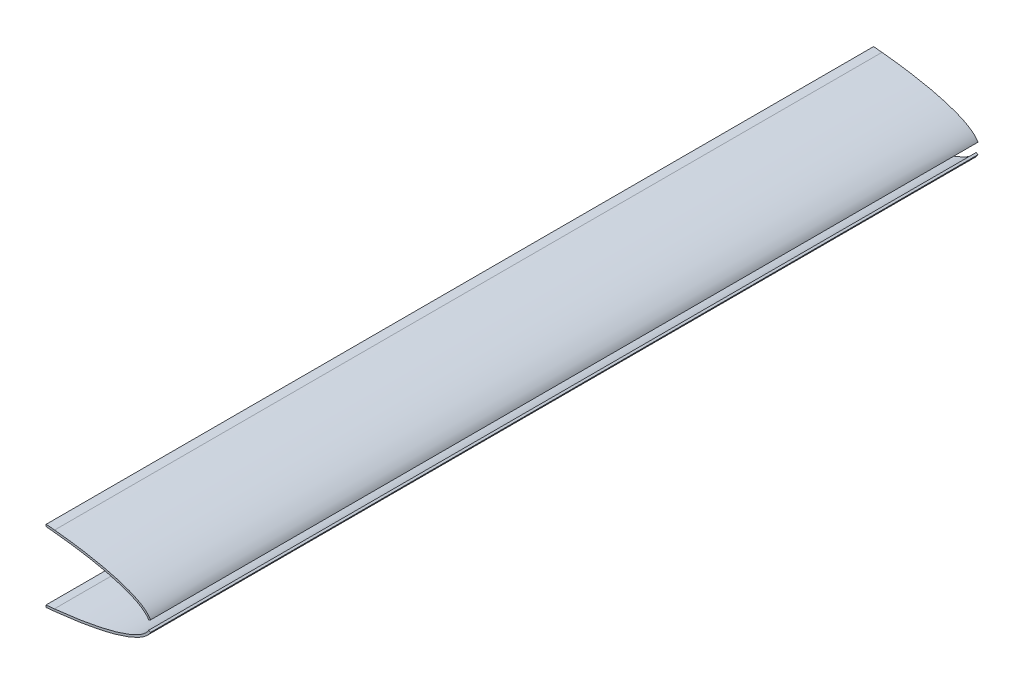
ISO-10303-21;
HEADER;
FILE_DESCRIPTION(('STEP AP214'),'2;1');
FILE_NAME('part.step','',(''),(''),'','','');
FILE_SCHEMA(('AUTOMOTIVE_DESIGN { 1 0 10303 214 1 1 1 1 }'));
ENDSEC;
DATA;
#1=APPLICATION_CONTEXT('core data for automotive mechanical design processes');
#2=APPLICATION_PROTOCOL_DEFINITION('international standard','automotive_design',2000,#1);
#3=PRODUCT_CONTEXT('',#1,'mechanical');
#4=PRODUCT('Part','Part','',(#3));
#5=PRODUCT_RELATED_PRODUCT_CATEGORY('part','',(#4));
#6=PRODUCT_DEFINITION_FORMATION('','',#4);
#7=PRODUCT_DEFINITION_CONTEXT('part definition',#1,'design');
#8=PRODUCT_DEFINITION('design','',#6,#7);
#9=PRODUCT_DEFINITION_SHAPE('','',#8);
#10=(LENGTH_UNIT() NAMED_UNIT(*) SI_UNIT(.MILLI.,.METRE.));
#11=(NAMED_UNIT(*) PLANE_ANGLE_UNIT() SI_UNIT($,.RADIAN.));
#12=(NAMED_UNIT(*) SI_UNIT($,.STERADIAN.) SOLID_ANGLE_UNIT());
#13=UNCERTAINTY_MEASURE_WITH_UNIT(LENGTH_MEASURE(1.E-05),#10,'distance_accuracy_value','');
#14=(GEOMETRIC_REPRESENTATION_CONTEXT(3) GLOBAL_UNCERTAINTY_ASSIGNED_CONTEXT((#13)) GLOBAL_UNIT_ASSIGNED_CONTEXT((#10,
#11,#12)) REPRESENTATION_CONTEXT('',''));
#15=CARTESIAN_POINT('',(0.,0.,0.));
#16=DIRECTION('',(0.,0.,1.));
#17=DIRECTION('',(1.,0.,0.));
#18=AXIS2_PLACEMENT_3D('',#15,#16,#17);
#19=CARTESIAN_POINT('',(-17.8267838835483,9.47682119762412,0.));
#20=DIRECTION('',(0.,0.,-1.));
#21=DIRECTION('',(-1.,0.,0.));
#22=AXIS2_PLACEMENT_3D('',#19,#20,#21);
#23=PLANE('',#22);
#24=DIRECTION('',(-0.995201674522241,0.0978449131438533,0.));
#25=VECTOR('',#24,1.);
#26=CARTESIAN_POINT('',(-39.9223356001921,13.5973067101086,0.));
#27=LINE('',#26,#25);
#28=CARTESIAN_POINT('',(-36.7625702835839,13.2866491108769,0.));
#29=VERTEX_POINT('',#28);
#30=CARTESIAN_POINT('',(-39.9223356001921,13.5973067101086,0.));
#31=VERTEX_POINT('',#30);
#32=EDGE_CURVE('E102',#29,#31,#27,.T.);
#33=ORIENTED_EDGE('',*,*,#32,.T.);
#34=DIRECTION('',(0.0978449131438549,0.99520167452224,0.));
#35=VECTOR('',#34,1.);
#36=CARTESIAN_POINT('',(-40.,12.8073653809566,0.));
#37=LINE('',#36,#35);
#38=CARTESIAN_POINT('',(-40.,12.8073653809566,0.));
#39=VERTEX_POINT('',#38);
#40=EDGE_CURVE('E112',#39,#31,#37,.T.);
#41=ORIENTED_EDGE('',*,*,#40,.F.);
#42=DIRECTION('',(-0.995201674522241,0.0978449131438533,0.));
#43=VECTOR('',#42,1.);
#44=CARTESIAN_POINT('',(-40.,12.8073653809566,0.));
#45=LINE('',#44,#43);
#46=CARTESIAN_POINT('',(-36.8402346833918,12.4967077817249,0.));
#47=VERTEX_POINT('',#46);
#48=EDGE_CURVE('E117',#47,#39,#45,.T.);
#49=ORIENTED_EDGE('',*,*,#48,.F.);
#50=CARTESIAN_POINT('',(-1.24390658489826,1.66378358121929,0.));
#51=CARTESIAN_POINT('',(-1.48860479567891,2.11173841568091,0.));
#52=CARTESIAN_POINT('',(-2.18721549392838,2.9915410497157,0.));
#53=CARTESIAN_POINT('',(-3.56684606177441,4.12640868291193,0.));
#54=CARTESIAN_POINT('',(-5.70242251125246,5.44787577324311,0.));
#55=CARTESIAN_POINT('',(-8.61610729828475,6.76639290695171,0.));
#56=CARTESIAN_POINT('',(-12.270596889148,8.02813836591854,0.));
#57=CARTESIAN_POINT('',(-16.0123966431418,9.06626054111463,0.));
#58=CARTESIAN_POINT('',(-21.070097899829,10.2293693862457,0.));
#59=CARTESIAN_POINT('',(-27.474178441719,11.3617862397886,0.));
#60=CARTESIAN_POINT('',(-33.1756249099201,12.1012569038898,0.));
#61=CARTESIAN_POINT('',(-36.3030087720962,12.4403332320218,0.));
#62=CARTESIAN_POINT('',(-36.8402346833918,12.4967077817249,0.));
#63=B_SPLINE_CURVE_WITH_KNOTS('',3,(#50,#51,#52,#53,#54,#55,#56,#57,#58,#59,#60,#61,#62),
.UNSPECIFIED.,.F.,.F.,(4,1,1,1,1,1,1,1,1,1,4),(0.419885952901703,0.423416199832594,
0.427262438250806,0.431108676669019,0.438801153505443,0.446493630341868,0.454186107178292,
0.461878584014717,0.477263537687566,0.492648491360415,0.49583777009465),.UNSPECIFIED.);
#64=CARTESIAN_POINT('',(-1.24390658489826,1.66378358121929,0.));
#65=VERTEX_POINT('',#64);
#66=EDGE_CURVE('E129',#65,#47,#63,.T.);
#67=ORIENTED_EDGE('',*,*,#66,.F.);
#68=DIRECTION('',(-0.877599566613759,-0.479394410354713,0.));
#69=VECTOR('',#68,1.);
#70=CARTESIAN_POINT('',(-0.547311928898585,2.04430289443835,0.));
#71=LINE('',#70,#69);
#72=CARTESIAN_POINT('',(-0.547311928898585,2.04430289443835,0.));
#73=VERTEX_POINT('',#72);
#74=EDGE_CURVE('E133',#73,#65,#71,.T.);
#75=ORIENTED_EDGE('',*,*,#74,.F.);
#76=CARTESIAN_POINT('',(-0.547311928898588,2.04430289443835,0.));
#77=CARTESIAN_POINT('',(-0.742452555230262,2.40153515669752,0.));
#78=CARTESIAN_POINT('',(-0.978871222160533,2.73276732503177,0.));
#79=CARTESIAN_POINT('',(-1.50095969632098,3.3510397947876,0.));
#80=CARTESIAN_POINT('',(-1.78583987074471,3.63774075179793,0.));
#81=CARTESIAN_POINT('',(-2.68772385093515,4.44645055634845,0.));
#82=CARTESIAN_POINT('',(-3.34981290597311,4.91587372171695,0.));
#83=CARTESIAN_POINT('',(-4.72430500394808,5.76618124411193,0.));
#84=CARTESIAN_POINT('',(-5.43643688770976,6.14668207644938,0.));
#85=CARTESIAN_POINT('',(-6.89167647601701,6.84788997752939,0.));
#86=CARTESIAN_POINT('',(-7.63491447562696,7.16725907680991,0.));
#87=CARTESIAN_POINT('',(-9.88457449765326,8.05960638794077,0.));
#88=CARTESIAN_POINT('',(-11.41796986349,8.56968927722106,0.));
#89=CARTESIAN_POINT('',(-14.5139146726733,9.48310358153928,0.));
#90=CARTESIAN_POINT('',(-16.0777655978353,9.8855129673522,0.));
#91=CARTESIAN_POINT('',(-20.7937299410926,10.9806945347714,0.));
#92=CARTESIAN_POINT('',(-23.9705894672898,11.5634191498812,0.));
#93=CARTESIAN_POINT('',(-28.7548316760731,12.3021854418957,0.));
#94=CARTESIAN_POINT('',(-30.3530635628128,12.5256161016781,0.));
#95=CARTESIAN_POINT('',(-32.7542036699774,12.8316251026852,0.));
#96=CARTESIAN_POINT('',(-33.5552061921999,12.9287689266811,0.));
#97=CARTESIAN_POINT('',(-34.757442830836,13.0678257471092,0.));
#98=CARTESIAN_POINT('',(-35.1583058222855,13.1130691944258,0.));
#99=CARTESIAN_POINT('',(-35.9602710933766,13.201436773247,0.));
#100=CARTESIAN_POINT('',(-36.3627073317402,13.2446891129014,0.));
#101=CARTESIAN_POINT('',(-36.7625702835839,13.2866491108769,0.));
#102=B_SPLINE_CURVE_WITH_KNOTS('',3,(#76,#77,#78,#79,#80,#81,#82,#83,#84,#85,#86,#87,#88,#89,
#90,#91,#92,#93,#94,#95,#96,#97,#98,#99,#100,#101),.UNSPECIFIED.,.F.,.F.,(4,2,2,2,2,2,2,2,2,2,2,
2,4),(0.,0.03125,0.0625000000000001,0.125,0.1875,0.25,0.375,0.5,0.75,0.875,0.9375,0.96875,1.),.UNSPECIFIED.);
#103=EDGE_CURVE('E108',#73,#29,#102,.T.);
#104=ORIENTED_EDGE('',*,*,#103,.T.);
#105=EDGE_LOOP('',(#33,#41,#49,#67,#75,#104));
#106=FACE_BOUND('',#105,.T.);
#107=ADVANCED_FACE('F47',(#106),#23,.F.);
#108=CARTESIAN_POINT('',(-40.,12.8073653809566,-353.318000561689));
#109=DIRECTION('',(0.995201674522241,-0.0978449131438549,0.));
#110=DIRECTION('',(0.0978449131438549,0.995201674522241,0.));
#111=AXIS2_PLACEMENT_3D('',#108,#109,#110);
#112=PLANE('',#111);
#113=DIRECTION('',(0.,0.,1.));
#114=VECTOR('',#113,1.);
#115=CARTESIAN_POINT('',(-39.9223356001921,13.5973067101086,-353.318000561689));
#116=LINE('',#115,#114);
#117=CARTESIAN_POINT('',(-39.9223356001921,13.5973067101086,-312.1));
#118=VERTEX_POINT('',#117);
#119=EDGE_CURVE('E99',#118,#31,#116,.T.);
#120=ORIENTED_EDGE('',*,*,#119,.F.);
#121=DIRECTION('',(-0.0978449131438549,-0.995201674522241,0.));
#122=VECTOR('',#121,1.);
#123=CARTESIAN_POINT('',(-40.,12.8073653809566,-312.1));
#124=LINE('',#123,#122);
#125=CARTESIAN_POINT('',(-40.,12.8073653809566,-312.1));
#126=VERTEX_POINT('',#125);
#127=EDGE_CURVE('E52',#118,#126,#124,.T.);
#128=ORIENTED_EDGE('',*,*,#127,.T.);
#129=DIRECTION('',(0.,0.,1.));
#130=VECTOR('',#129,1.);
#131=CARTESIAN_POINT('',(-40.,12.8073653809566,-353.318000561689));
#132=LINE('',#131,#130);
#133=EDGE_CURVE('E107',#126,#39,#132,.T.);
#134=ORIENTED_EDGE('',*,*,#133,.T.);
#135=ORIENTED_EDGE('',*,*,#40,.T.);
#136=EDGE_LOOP('',(#120,#128,#134,#135));
#137=FACE_BOUND('',#136,.T.);
#138=ADVANCED_FACE('F115',(#137),#112,.F.);
#139=CARTESIAN_POINT('',(-40.,12.8073653809566,-353.318000561689));
#140=DIRECTION('',(0.0978449131438533,0.995201674522241,0.));
#141=DIRECTION('',(-0.995201674522241,0.0978449131438533,0.));
#142=AXIS2_PLACEMENT_3D('',#139,#140,#141);
#143=PLANE('',#142);
#144=ORIENTED_EDGE('',*,*,#133,.F.);
#145=DIRECTION('',(0.995201674522241,-0.0978449131438533,0.));
#146=VECTOR('',#145,1.);
#147=CARTESIAN_POINT('',(-40.,12.8073653809566,-312.1));
#148=LINE('',#147,#146);
#149=CARTESIAN_POINT('',(-36.8402346833918,12.4967077817249,-312.1));
#150=VERTEX_POINT('',#149);
#151=EDGE_CURVE('E160',#126,#150,#148,.T.);
#152=ORIENTED_EDGE('',*,*,#151,.T.);
#153=DIRECTION('',(0.,0.,1.));
#154=VECTOR('',#153,1.);
#155=CARTESIAN_POINT('',(-36.8402346833918,12.4967077817249,-353.318000561689));
#156=LINE('',#155,#154);
#157=EDGE_CURVE('E155',#150,#47,#156,.T.);
#158=ORIENTED_EDGE('',*,*,#157,.T.);
#159=ORIENTED_EDGE('',*,*,#48,.T.);
#160=EDGE_LOOP('',(#144,#152,#158,#159));
#161=FACE_BOUND('',#160,.T.);
#162=ADVANCED_FACE('F156',(#161),#143,.F.);
#163=CARTESIAN_POINT('',(-1.24390658489826,1.66378358121929,-353.318000561689));
#164=CARTESIAN_POINT('',(-1.48860479567891,2.11173841568091,-353.318000561689));
#165=CARTESIAN_POINT('',(-2.18721549392838,2.9915410497157,-353.318000561689));
#166=CARTESIAN_POINT('',(-3.56684606177441,4.12640868291193,-353.318000561689));
#167=CARTESIAN_POINT('',(-5.70242251125246,5.44787577324311,-353.318000561689));
#168=CARTESIAN_POINT('',(-8.61610729828475,6.76639290695171,-353.318000561689));
#169=CARTESIAN_POINT('',(-12.270596889148,8.02813836591854,-353.318000561689));
#170=CARTESIAN_POINT('',(-16.0123966431418,9.06626054111463,-353.318000561689));
#171=CARTESIAN_POINT('',(-21.070097899829,10.2293693862457,-353.318000561689));
#172=CARTESIAN_POINT('',(-27.474178441719,11.3617862397886,-353.318000561689));
#173=CARTESIAN_POINT('',(-33.1756249099201,12.1012569038898,-353.318000561689));
#174=CARTESIAN_POINT('',(-36.3030087720962,12.4403332320218,-353.318000561689));
#175=CARTESIAN_POINT('',(-36.8402346833918,12.4967077817249,-353.318000561689));
#176=B_SPLINE_CURVE_WITH_KNOTS('',3,(#163,#164,#165,#166,#167,#168,#169,#170,#171,#172,#173,
#174,#175),.UNSPECIFIED.,.F.,.F.,(4,1,1,1,1,1,1,1,1,1,4),(0.419885952901703,0.423416199832594,
0.427262438250806,0.431108676669019,0.438801153505443,0.446493630341868,0.454186107178292,
0.461878584014717,0.477263537687566,0.492648491360415,0.49583777009465),.UNSPECIFIED.);
#177=DIRECTION('',(0.,0.,1.));
#178=VECTOR('',#177,1.);
#179=SURFACE_OF_LINEAR_EXTRUSION('',#176,#178);
#180=ORIENTED_EDGE('',*,*,#157,.F.);
#181=CARTESIAN_POINT('',(-1.24390658489826,1.66378358121929,-312.1));
#182=CARTESIAN_POINT('',(-1.48860479567891,2.11173841568091,-312.1));
#183=CARTESIAN_POINT('',(-2.18721549392838,2.9915410497157,-312.1));
#184=CARTESIAN_POINT('',(-3.56684606177441,4.12640868291193,-312.1));
#185=CARTESIAN_POINT('',(-5.70242251125246,5.44787577324311,-312.1));
#186=CARTESIAN_POINT('',(-8.61610729828475,6.76639290695171,-312.1));
#187=CARTESIAN_POINT('',(-12.270596889148,8.02813836591854,-312.1));
#188=CARTESIAN_POINT('',(-16.0123966431418,9.06626054111463,-312.1));
#189=CARTESIAN_POINT('',(-21.070097899829,10.2293693862457,-312.1));
#190=CARTESIAN_POINT('',(-27.474178441719,11.3617862397886,-312.1));
#191=CARTESIAN_POINT('',(-33.1756249099201,12.1012569038898,-312.1));
#192=CARTESIAN_POINT('',(-36.3030087720962,12.4403332320218,-312.1));
#193=CARTESIAN_POINT('',(-36.8402346833918,12.4967077817249,-312.1));
#194=B_SPLINE_CURVE_WITH_KNOTS('',3,(#181,#182,#183,#184,#185,#186,#187,#188,#189,#190,#191,
#192,#193),.UNSPECIFIED.,.F.,.F.,(4,1,1,1,1,1,1,1,1,1,4),(0.419885952901703,0.423416199832594,
0.427262438250806,0.431108676669019,0.438801153505443,0.446493630341868,0.454186107178292,
0.461878584014717,0.477263537687566,0.492648491360415,0.49583777009465),.UNSPECIFIED.);
#195=CARTESIAN_POINT('',(-1.24390658489826,1.66378358121929,-312.1));
#196=VERTEX_POINT('',#195);
#197=EDGE_CURVE('E70',#150,#196,#194,.F.);
#198=ORIENTED_EDGE('',*,*,#197,.T.);
#199=DIRECTION('',(0.,0.,1.));
#200=VECTOR('',#199,1.);
#201=CARTESIAN_POINT('',(-1.24390658489826,1.66378358121929,-353.318000561689));
#202=LINE('',#201,#200);
#203=EDGE_CURVE('E147',#196,#65,#202,.T.);
#204=ORIENTED_EDGE('',*,*,#203,.T.);
#205=ORIENTED_EDGE('',*,*,#66,.T.);
#206=EDGE_LOOP('',(#180,#198,#204,#205));
#207=FACE_BOUND('',#206,.T.);
#208=ADVANCED_FACE('F159',(#207),#179,.F.);
#209=CARTESIAN_POINT('',(-0.547311928898585,2.04430289443835,-353.318000561689));
#210=DIRECTION('',(-0.479394410354713,0.877599566613759,0.));
#211=DIRECTION('',(-0.877599566613759,-0.479394410354713,0.));
#212=AXIS2_PLACEMENT_3D('',#209,#210,#211);
#213=PLANE('',#212);
#214=ORIENTED_EDGE('',*,*,#203,.F.);
#215=DIRECTION('',(0.877599566613759,0.479394410354713,0.));
#216=VECTOR('',#215,1.);
#217=CARTESIAN_POINT('',(-0.547311928898585,2.04430289443835,-312.1));
#218=LINE('',#217,#216);
#219=CARTESIAN_POINT('',(-0.547311928898585,2.04430289443835,-312.1));
#220=VERTEX_POINT('',#219);
#221=EDGE_CURVE('E168',#196,#220,#218,.T.);
#222=ORIENTED_EDGE('',*,*,#221,.T.);
#223=DIRECTION('',(0.,0.,1.));
#224=VECTOR('',#223,1.);
#225=CARTESIAN_POINT('',(-0.547311928898585,2.04430289443835,-353.318000561689));
#226=LINE('',#225,#224);
#227=EDGE_CURVE('E146',#220,#73,#226,.T.);
#228=ORIENTED_EDGE('',*,*,#227,.T.);
#229=ORIENTED_EDGE('',*,*,#74,.T.);
#230=EDGE_LOOP('',(#214,#222,#228,#229));
#231=FACE_BOUND('',#230,.T.);
#232=ADVANCED_FACE('F192',(#231),#213,.F.);
#233=CARTESIAN_POINT('',(-0.547311928898588,2.04430289443835,-353.318000561689));
#234=CARTESIAN_POINT('',(-0.742452555230262,2.40153515669752,-353.318000561689));
#235=CARTESIAN_POINT('',(-0.978871222160533,2.73276732503177,-353.318000561689));
#236=CARTESIAN_POINT('',(-1.50095969632098,3.3510397947876,-353.318000561689));
#237=CARTESIAN_POINT('',(-1.78583987074471,3.63774075179793,-353.318000561689));
#238=CARTESIAN_POINT('',(-2.68772385093515,4.44645055634845,-353.318000561689));
#239=CARTESIAN_POINT('',(-3.34981290597311,4.91587372171695,-353.318000561689));
#240=CARTESIAN_POINT('',(-4.72430500394808,5.76618124411193,-353.318000561689));
#241=CARTESIAN_POINT('',(-5.43643688770976,6.14668207644938,-353.318000561689));
#242=CARTESIAN_POINT('',(-6.89167647601701,6.84788997752939,-353.318000561689));
#243=CARTESIAN_POINT('',(-7.63491447562696,7.16725907680991,-353.318000561689));
#244=CARTESIAN_POINT('',(-9.88457449765326,8.05960638794077,-353.318000561689));
#245=CARTESIAN_POINT('',(-11.41796986349,8.56968927722106,-353.318000561689));
#246=CARTESIAN_POINT('',(-14.5139146726733,9.48310358153928,-353.318000561689));
#247=CARTESIAN_POINT('',(-16.0777655978353,9.8855129673522,-353.318000561689));
#248=CARTESIAN_POINT('',(-20.7937299410926,10.9806945347714,-353.318000561689));
#249=CARTESIAN_POINT('',(-23.9705894672898,11.5634191498812,-353.318000561689));
#250=CARTESIAN_POINT('',(-28.7548316760731,12.3021854418957,-353.318000561689));
#251=CARTESIAN_POINT('',(-30.3530635628128,12.5256161016781,-353.318000561689));
#252=CARTESIAN_POINT('',(-32.7542036699774,12.8316251026852,-353.318000561689));
#253=CARTESIAN_POINT('',(-33.5552061921999,12.9287689266811,-353.318000561689));
#254=CARTESIAN_POINT('',(-34.757442830836,13.0678257471092,-353.318000561689));
#255=CARTESIAN_POINT('',(-35.1583058222855,13.1130691944258,-353.318000561689));
#256=CARTESIAN_POINT('',(-35.9602710933766,13.201436773247,-353.318000561689));
#257=CARTESIAN_POINT('',(-36.3627073317402,13.2446891129014,-353.318000561689));
#258=CARTESIAN_POINT('',(-36.7625702835839,13.2866491108769,-353.318000561689));
#259=B_SPLINE_CURVE_WITH_KNOTS('',3,(#233,#234,#235,#236,#237,#238,#239,#240,#241,#242,#243,
#244,#245,#246,#247,#248,#249,#250,#251,#252,#253,#254,#255,#256,#257,#258),.UNSPECIFIED.,.F.,
.F.,(4,2,2,2,2,2,2,2,2,2,2,2,4),(0.,0.03125,0.0625000000000001,0.125,0.1875,0.25,0.375,0.5,0.75,
0.875,0.9375,0.96875,1.),.UNSPECIFIED.);
#260=DIRECTION('',(0.,0.,1.));
#261=VECTOR('',#260,1.);
#262=SURFACE_OF_LINEAR_EXTRUSION('',#259,#261);
#263=CARTESIAN_POINT('',(-0.547311928898588,2.04430289443835,-312.1));
#264=CARTESIAN_POINT('',(-0.742452555230262,2.40153515669752,-312.1));
#265=CARTESIAN_POINT('',(-0.978871222160533,2.73276732503177,-312.1));
#266=CARTESIAN_POINT('',(-1.50095969632098,3.3510397947876,-312.1));
#267=CARTESIAN_POINT('',(-1.78583987074471,3.63774075179793,-312.1));
#268=CARTESIAN_POINT('',(-2.68772385093515,4.44645055634845,-312.1));
#269=CARTESIAN_POINT('',(-3.34981290597311,4.91587372171695,-312.1));
#270=CARTESIAN_POINT('',(-4.72430500394808,5.76618124411193,-312.1));
#271=CARTESIAN_POINT('',(-5.43643688770976,6.14668207644938,-312.1));
#272=CARTESIAN_POINT('',(-6.89167647601701,6.84788997752939,-312.1));
#273=CARTESIAN_POINT('',(-7.63491447562696,7.16725907680991,-312.1));
#274=CARTESIAN_POINT('',(-9.88457449765326,8.05960638794077,-312.1));
#275=CARTESIAN_POINT('',(-11.41796986349,8.56968927722106,-312.1));
#276=CARTESIAN_POINT('',(-14.5139146726733,9.48310358153928,-312.1));
#277=CARTESIAN_POINT('',(-16.0777655978353,9.8855129673522,-312.1));
#278=CARTESIAN_POINT('',(-20.7937299410926,10.9806945347714,-312.1));
#279=CARTESIAN_POINT('',(-23.9705894672898,11.5634191498812,-312.1));
#280=CARTESIAN_POINT('',(-28.7548316760731,12.3021854418957,-312.1));
#281=CARTESIAN_POINT('',(-30.3530635628128,12.5256161016781,-312.1));
#282=CARTESIAN_POINT('',(-32.7542036699774,12.8316251026852,-312.1));
#283=CARTESIAN_POINT('',(-33.5552061921999,12.9287689266811,-312.1));
#284=CARTESIAN_POINT('',(-34.757442830836,13.0678257471092,-312.1));
#285=CARTESIAN_POINT('',(-35.1583058222855,13.1130691944258,-312.1));
#286=CARTESIAN_POINT('',(-35.9602710933766,13.201436773247,-312.1));
#287=CARTESIAN_POINT('',(-36.3627073317402,13.2446891129014,-312.1));
#288=CARTESIAN_POINT('',(-36.7625702835839,13.2866491108769,-312.1));
#289=B_SPLINE_CURVE_WITH_KNOTS('',3,(#263,#264,#265,#266,#267,#268,#269,#270,#271,#272,#273,
#274,#275,#276,#277,#278,#279,#280,#281,#282,#283,#284,#285,#286,#287,#288),.UNSPECIFIED.,.F.,
.F.,(4,2,2,2,2,2,2,2,2,2,2,2,4),(0.,0.03125,0.0625000000000001,0.125,0.1875,0.25,0.375,0.5,0.75,
0.875,0.9375,0.96875,1.),.UNSPECIFIED.);
#290=CARTESIAN_POINT('',(-36.7625702835839,13.2866491108769,-312.1));
#291=VERTEX_POINT('',#290);
#292=EDGE_CURVE('E56',#291,#220,#289,.F.);
#293=ORIENTED_EDGE('',*,*,#292,.F.);
#294=DIRECTION('',(0.,0.,1.));
#295=VECTOR('',#294,1.);
#296=CARTESIAN_POINT('',(-36.7625702835839,13.2866491108769,-353.318000561689));
#297=LINE('',#296,#295);
#298=EDGE_CURVE('E141',#291,#29,#297,.T.);
#299=ORIENTED_EDGE('',*,*,#298,.T.);
#300=ORIENTED_EDGE('',*,*,#103,.F.);
#301=ORIENTED_EDGE('',*,*,#227,.F.);
#302=EDGE_LOOP('',(#293,#299,#300,#301));
#303=FACE_BOUND('',#302,.T.);
#304=ADVANCED_FACE('F167',(#303),#262,.T.);
#305=CARTESIAN_POINT('',(-39.9223356001921,13.5973067101086,-353.318000561689));
#306=DIRECTION('',(0.0978449131438533,0.995201674522241,0.));
#307=DIRECTION('',(-0.995201674522241,0.0978449131438533,0.));
#308=AXIS2_PLACEMENT_3D('',#305,#306,#307);
#309=PLANE('',#308);
#310=DIRECTION('',(0.995201674522241,-0.0978449131438533,0.));
#311=VECTOR('',#310,1.);
#312=CARTESIAN_POINT('',(-39.9223356001921,13.5973067101086,-312.1));
#313=LINE('',#312,#311);
#314=EDGE_CURVE('E12',#118,#291,#313,.T.);
#315=ORIENTED_EDGE('',*,*,#314,.F.);
#316=ORIENTED_EDGE('',*,*,#119,.T.);
#317=ORIENTED_EDGE('',*,*,#32,.F.);
#318=ORIENTED_EDGE('',*,*,#298,.F.);
#319=EDGE_LOOP('',(#315,#316,#317,#318));
#320=FACE_BOUND('',#319,.T.);
#321=ADVANCED_FACE('F51',(#320),#309,.T.);
#322=CARTESIAN_POINT('',(0.,2.49802891310789E-11,-312.1));
#323=DIRECTION('',(0.,0.,1.));
#324=DIRECTION('',(1.,0.,0.));
#325=AXIS2_PLACEMENT_3D('',#322,#323,#324);
#326=PLANE('',#325);
#327=ORIENTED_EDGE('',*,*,#314,.T.);
#328=ORIENTED_EDGE('',*,*,#292,.T.);
#329=ORIENTED_EDGE('',*,*,#221,.F.);
#330=ORIENTED_EDGE('',*,*,#197,.F.);
#331=ORIENTED_EDGE('',*,*,#151,.F.);
#332=ORIENTED_EDGE('',*,*,#127,.F.);
#333=EDGE_LOOP('',(#327,#328,#329,#330,#331,#332));
#334=FACE_BOUND('',#333,.T.);
#335=ADVANCED_FACE('F169',(#334),#326,.F.);
#336=CLOSED_SHELL('',(#107,#138,#162,#208,#232,#304,#321,#335));
#337=MANIFOLD_SOLID_BREP('B2',#336);
#338=CARTESIAN_POINT('',(-17.6497537122268,-10.2505734900239,0.));
#339=DIRECTION('',(0.,0.,-1.));
#340=DIRECTION('',(-1.,0.,0.));
#341=AXIS2_PLACEMENT_3D('',#338,#339,#340);
#342=PLANE('',#341);
#343=CARTESIAN_POINT('',(-36.7625702835782,-13.2866491113118,0.));
#344=CARTESIAN_POINT('',(-36.3627073317338,-13.2446891133315,0.));
#345=CARTESIAN_POINT('',(-35.9602710933695,-13.201436773672,0.));
#346=CARTESIAN_POINT('',(-35.1583058222769,-13.1130691948409,0.));
#347=CARTESIAN_POINT('',(-34.7574428308268,-13.0678257475193,0.));
#348=CARTESIAN_POINT('',(-33.5552061921887,-12.9287689270764,0.));
#349=CARTESIAN_POINT('',(-32.754203669965,-12.8316251030706,0.));
#350=CARTESIAN_POINT('',(-30.3530635627969,-12.5256161020337,0.));
#351=CARTESIAN_POINT('',(-28.7548316760551,-12.3021854422315,0.));
#352=CARTESIAN_POINT('',(-23.970589467266,-11.5634191501579,0.));
#353=CARTESIAN_POINT('',(-20.793729941066,-10.9806945350089,0.));
#354=CARTESIAN_POINT('',(-16.0777655978072,-9.88551296753135,0.));
#355=CARTESIAN_POINT('',(-14.5139146726453,-9.4831035816991,0.));
#356=CARTESIAN_POINT('',(-11.4179698634632,-8.56968927734283,0.));
#357=CARTESIAN_POINT('',(-9.8845744976277,-8.05960638804363,0.));
#358=CARTESIAN_POINT('',(-7.63491447560419,-7.16725907688599,0.));
#359=CARTESIAN_POINT('',(-6.89167647599525,-6.84788997759648,0.));
#360=CARTESIAN_POINT('',(-5.43643688769094,-6.14668207649927,0.));
#361=CARTESIAN_POINT('',(-4.72430500393065,-5.76618124415354,0.));
#362=CARTESIAN_POINT('',(-3.34981290595987,-4.9158737217431,0.));
#363=CARTESIAN_POINT('',(-2.68772385092497,-4.44645055636804,0.));
#364=CARTESIAN_POINT('',(-1.78583987073821,-3.63774075180923,0.));
#365=CARTESIAN_POINT('',(-1.50095969631501,-3.35103979479622,0.));
#366=CARTESIAN_POINT('',(-0.978871222155335,-2.7327673250349,0.));
#367=CARTESIAN_POINT('',(-0.742452555225429,-2.40153515669796,0.));
#368=CARTESIAN_POINT('',(-0.5473119288943,-2.04430289443583,0.));
#369=B_SPLINE_CURVE_WITH_KNOTS('',3,(#343,#344,#345,#346,#347,#348,#349,#350,#351,#352,#353,
#354,#355,#356,#357,#358,#359,#360,#361,#362,#363,#364,#365,#366,#367,#368),.UNSPECIFIED.,.F.,
.F.,(4,2,2,2,2,2,2,2,2,2,2,2,4),(0.,0.0312500000000002,0.0625000000000004,0.125,0.25,0.5,0.625,
0.75,0.8125,0.875,0.9375,0.96875,1.),.UNSPECIFIED.);
#370=CARTESIAN_POINT('',(-36.7625702835782,-13.2866491113119,0.));
#371=VERTEX_POINT('',#370);
#372=CARTESIAN_POINT('',(-0.547311928894318,-2.04430289443584,0.));
#373=VERTEX_POINT('',#372);
#374=EDGE_CURVE('E312',#371,#373,#369,.T.);
#375=ORIENTED_EDGE('',*,*,#374,.T.);
#376=DIRECTION('',(0.877599566616028,-0.479394410350559,0.));
#377=VECTOR('',#376,1.);
#378=CARTESIAN_POINT('',(-1.24390658489579,-1.66378358122008,0.));
#379=LINE('',#378,#377);
#380=CARTESIAN_POINT('',(-1.24390658489579,-1.66378358122008,0.));
#381=VERTEX_POINT('',#380);
#382=EDGE_CURVE('E325',#381,#373,#379,.T.);
#383=ORIENTED_EDGE('',*,*,#382,.F.);
#384=CARTESIAN_POINT('',(-36.8402346833957,-12.4967077821608,0.));
#385=CARTESIAN_POINT('',(-36.3030087721083,-12.4403332324521,0.));
#386=CARTESIAN_POINT('',(-33.1756249099438,-12.1012569042834,0.));
#387=CARTESIAN_POINT('',(-27.4741784417591,-11.3617862401158,0.));
#388=CARTESIAN_POINT('',(-21.0700978998813,-10.2293693865,0.));
#389=CARTESIAN_POINT('',(-16.0123966432064,-9.06626054131374,0.));
#390=CARTESIAN_POINT('',(-12.2705968892229,-8.02813836607902,0.));
#391=CARTESIAN_POINT('',(-8.61610729837016,-6.7663929070781,0.));
#392=CARTESIAN_POINT('',(-5.7024225113453,-5.4478757733485,0.));
#393=CARTESIAN_POINT('',(-3.5668460618679,-4.12640868300929,0.));
#394=CARTESIAN_POINT('',(-2.18721549398158,-2.99154104978799,0.));
#395=CARTESIAN_POINT('',(-1.4886047956942,-2.11173841571923,0.));
#396=CARTESIAN_POINT('',(-1.24390658489579,-1.66378358122008,0.));
#397=B_SPLINE_CURVE_WITH_KNOTS('',3,(#384,#385,#386,#387,#388,#389,#390,#391,#392,#393,#394,
#395,#396),.UNSPECIFIED.,.F.,.F.,(4,1,1,1,1,1,1,1,1,1,4),(0.504162229905444,0.507351508639632,
0.522736462312481,0.538121415985331,0.545813892821755,0.55350636965818,0.561198846494604,
0.568891323331029,0.572737561749241,0.576583800167453,0.580114047098618),.UNSPECIFIED.);
#398=CARTESIAN_POINT('',(-36.8402346833957,-12.4967077821608,0.));
#399=VERTEX_POINT('',#398);
#400=EDGE_CURVE('E327',#399,#381,#397,.T.);
#401=ORIENTED_EDGE('',*,*,#400,.F.);
#402=DIRECTION('',(0.995201674521062,0.0978449131558446,0.));
#403=VECTOR('',#402,1.);
#404=CARTESIAN_POINT('',(-40.,-12.8073653814306,0.));
#405=LINE('',#404,#403);
#406=CARTESIAN_POINT('',(-40.,-12.8073653814306,0.));
#407=VERTEX_POINT('',#406);
#408=EDGE_CURVE('E347',#407,#399,#405,.T.);
#409=ORIENTED_EDGE('',*,*,#408,.F.);
#410=DIRECTION('',(-0.0978449131558489,0.995201674521061,0.));
#411=VECTOR('',#410,1.);
#412=CARTESIAN_POINT('',(-39.9223356001825,-13.5973067105817,0.));
#413=LINE('',#412,#411);
#414=CARTESIAN_POINT('',(-39.9223356001825,-13.5973067105817,0.));
#415=VERTEX_POINT('',#414);
#416=EDGE_CURVE('E352',#415,#407,#413,.T.);
#417=ORIENTED_EDGE('',*,*,#416,.F.);
#418=DIRECTION('',(0.995201674521062,0.0978449131558446,0.));
#419=VECTOR('',#418,1.);
#420=CARTESIAN_POINT('',(-39.9223356001825,-13.5973067105817,0.));
#421=LINE('',#420,#419);
#422=EDGE_CURVE('E319',#415,#371,#421,.T.);
#423=ORIENTED_EDGE('',*,*,#422,.T.);
#424=EDGE_LOOP('',(#375,#383,#401,#409,#417,#423));
#425=FACE_BOUND('',#424,.T.);
#426=ADVANCED_FACE('F259',(#425),#342,.F.);
#427=CARTESIAN_POINT('',(-1.24390658489579,-1.66378358122008,-353.318000561829));
#428=DIRECTION('',(-0.479394410350559,-0.877599566616028,0.));
#429=DIRECTION('',(0.877599566616028,-0.479394410350559,0.));
#430=AXIS2_PLACEMENT_3D('',#427,#428,#429);
#431=PLANE('',#430);
#432=DIRECTION('',(0.,0.,1.));
#433=VECTOR('',#432,1.);
#434=CARTESIAN_POINT('',(-0.547311928894318,-2.04430289443584,-353.318000561829));
#435=LINE('',#434,#433);
#436=CARTESIAN_POINT('',(-0.547311928894318,-2.04430289443584,-312.1));
#437=VERTEX_POINT('',#436);
#438=EDGE_CURVE('E313',#437,#373,#435,.T.);
#439=ORIENTED_EDGE('',*,*,#438,.F.);
#440=DIRECTION('',(-0.877599566616028,0.479394410350559,0.));
#441=VECTOR('',#440,1.);
#442=CARTESIAN_POINT('',(-1.24390658489579,-1.66378358122008,-312.1));
#443=LINE('',#442,#441);
#444=CARTESIAN_POINT('',(-1.24390658489579,-1.66378358122008,-312.1));
#445=VERTEX_POINT('',#444);
#446=EDGE_CURVE('E262',#437,#445,#443,.T.);
#447=ORIENTED_EDGE('',*,*,#446,.T.);
#448=DIRECTION('',(0.,0.,1.));
#449=VECTOR('',#448,1.);
#450=CARTESIAN_POINT('',(-1.24390658489579,-1.66378358122008,-353.318000561829));
#451=LINE('',#450,#449);
#452=EDGE_CURVE('E317',#445,#381,#451,.T.);
#453=ORIENTED_EDGE('',*,*,#452,.T.);
#454=ORIENTED_EDGE('',*,*,#382,.T.);
#455=EDGE_LOOP('',(#439,#447,#453,#454));
#456=FACE_BOUND('',#455,.T.);
#457=ADVANCED_FACE('F323',(#456),#431,.F.);
#458=CARTESIAN_POINT('',(-36.8402346833957,-12.4967077821608,-353.318000561829));
#459=CARTESIAN_POINT('',(-36.3030087721083,-12.4403332324521,-353.318000561829));
#460=CARTESIAN_POINT('',(-33.1756249099438,-12.1012569042834,-353.318000561829));
#461=CARTESIAN_POINT('',(-27.4741784417591,-11.3617862401158,-353.318000561829));
#462=CARTESIAN_POINT('',(-21.0700978998813,-10.2293693865,-353.318000561829));
#463=CARTESIAN_POINT('',(-16.0123966432064,-9.06626054131374,-353.318000561829));
#464=CARTESIAN_POINT('',(-12.2705968892229,-8.02813836607902,-353.318000561829));
#465=CARTESIAN_POINT('',(-8.61610729837016,-6.7663929070781,-353.318000561829));
#466=CARTESIAN_POINT('',(-5.7024225113453,-5.4478757733485,-353.318000561829));
#467=CARTESIAN_POINT('',(-3.5668460618679,-4.12640868300929,-353.318000561829));
#468=CARTESIAN_POINT('',(-2.18721549398158,-2.99154104978799,-353.318000561829));
#469=CARTESIAN_POINT('',(-1.4886047956942,-2.11173841571923,-353.318000561829));
#470=CARTESIAN_POINT('',(-1.24390658489579,-1.66378358122008,-353.318000561829));
#471=B_SPLINE_CURVE_WITH_KNOTS('',3,(#458,#459,#460,#461,#462,#463,#464,#465,#466,#467,#468,
#469,#470),.UNSPECIFIED.,.F.,.F.,(4,1,1,1,1,1,1,1,1,1,4),(0.504162229905444,0.507351508639632,
0.522736462312481,0.538121415985331,0.545813892821755,0.55350636965818,0.561198846494604,
0.568891323331029,0.572737561749241,0.576583800167453,0.580114047098618),.UNSPECIFIED.);
#472=DIRECTION('',(0.,0.,1.));
#473=VECTOR('',#472,1.);
#474=SURFACE_OF_LINEAR_EXTRUSION('',#471,#473);
#475=ORIENTED_EDGE('',*,*,#452,.F.);
#476=CARTESIAN_POINT('',(-36.8402346833957,-12.4967077821608,-312.1));
#477=CARTESIAN_POINT('',(-36.3030087721083,-12.4403332324521,-312.1));
#478=CARTESIAN_POINT('',(-33.1756249099438,-12.1012569042834,-312.1));
#479=CARTESIAN_POINT('',(-27.4741784417591,-11.3617862401158,-312.1));
#480=CARTESIAN_POINT('',(-21.0700978998813,-10.2293693865,-312.1));
#481=CARTESIAN_POINT('',(-16.0123966432064,-9.06626054131374,-312.1));
#482=CARTESIAN_POINT('',(-12.2705968892229,-8.02813836607902,-312.1));
#483=CARTESIAN_POINT('',(-8.61610729837016,-6.7663929070781,-312.1));
#484=CARTESIAN_POINT('',(-5.7024225113453,-5.4478757733485,-312.1));
#485=CARTESIAN_POINT('',(-3.5668460618679,-4.12640868300929,-312.1));
#486=CARTESIAN_POINT('',(-2.18721549398158,-2.99154104978799,-312.1));
#487=CARTESIAN_POINT('',(-1.4886047956942,-2.11173841571923,-312.1));
#488=CARTESIAN_POINT('',(-1.24390658489579,-1.66378358122008,-312.1));
#489=B_SPLINE_CURVE_WITH_KNOTS('',3,(#476,#477,#478,#479,#480,#481,#482,#483,#484,#485,#486,
#487,#488),.UNSPECIFIED.,.F.,.F.,(4,1,1,1,1,1,1,1,1,1,4),(0.504162229905444,0.507351508639632,
0.522736462312481,0.538121415985331,0.545813892821755,0.55350636965818,0.561198846494604,
0.568891323331029,0.572737561749241,0.576583800167453,0.580114047098618),.UNSPECIFIED.);
#490=CARTESIAN_POINT('',(-36.8402346833957,-12.4967077821608,-312.1));
#491=VERTEX_POINT('',#490);
#492=EDGE_CURVE('E370',#445,#491,#489,.F.);
#493=ORIENTED_EDGE('',*,*,#492,.T.);
#494=DIRECTION('',(0.,0.,1.));
#495=VECTOR('',#494,1.);
#496=CARTESIAN_POINT('',(-36.8402346833957,-12.4967077821608,-353.318000561829));
#497=LINE('',#496,#495);
#498=EDGE_CURVE('E362',#491,#399,#497,.T.);
#499=ORIENTED_EDGE('',*,*,#498,.T.);
#500=ORIENTED_EDGE('',*,*,#400,.T.);
#501=EDGE_LOOP('',(#475,#493,#499,#500));
#502=FACE_BOUND('',#501,.T.);
#503=ADVANCED_FACE('F368',(#502),#474,.F.);
#504=CARTESIAN_POINT('',(-40.,-12.8073653814306,-353.318000561829));
#505=DIRECTION('',(0.0978449131558446,-0.995201674521062,0.));
#506=DIRECTION('',(0.995201674521062,0.0978449131558446,0.));
#507=AXIS2_PLACEMENT_3D('',#504,#505,#506);
#508=PLANE('',#507);
#509=ORIENTED_EDGE('',*,*,#498,.F.);
#510=DIRECTION('',(-0.995201674521062,-0.0978449131558446,0.));
#511=VECTOR('',#510,1.);
#512=CARTESIAN_POINT('',(-40.,-12.8073653814306,-312.1));
#513=LINE('',#512,#511);
#514=CARTESIAN_POINT('',(-40.,-12.8073653814306,-312.1));
#515=VERTEX_POINT('',#514);
#516=EDGE_CURVE('E279',#491,#515,#513,.T.);
#517=ORIENTED_EDGE('',*,*,#516,.T.);
#518=DIRECTION('',(0.,0.,1.));
#519=VECTOR('',#518,1.);
#520=CARTESIAN_POINT('',(-40.,-12.8073653814306,-353.318000561829));
#521=LINE('',#520,#519);
#522=EDGE_CURVE('E359',#515,#407,#521,.T.);
#523=ORIENTED_EDGE('',*,*,#522,.T.);
#524=ORIENTED_EDGE('',*,*,#408,.T.);
#525=EDGE_LOOP('',(#509,#517,#523,#524));
#526=FACE_BOUND('',#525,.T.);
#527=ADVANCED_FACE('F367',(#526),#508,.F.);
#528=CARTESIAN_POINT('',(-39.9223356001825,-13.5973067105817,-353.318000561829));
#529=DIRECTION('',(0.995201674521061,0.0978449131558489,0.));
#530=DIRECTION('',(-0.0978449131558489,0.995201674521061,0.));
#531=AXIS2_PLACEMENT_3D('',#528,#529,#530);
#532=PLANE('',#531);
#533=ORIENTED_EDGE('',*,*,#522,.F.);
#534=DIRECTION('',(0.0978449131558489,-0.995201674521061,0.));
#535=VECTOR('',#534,1.);
#536=CARTESIAN_POINT('',(-39.9223356001825,-13.5973067105817,-312.1));
#537=LINE('',#536,#535);
#538=CARTESIAN_POINT('',(-39.9223356001825,-13.5973067105817,-312.1));
#539=VERTEX_POINT('',#538);
#540=EDGE_CURVE('E379',#515,#539,#537,.T.);
#541=ORIENTED_EDGE('',*,*,#540,.T.);
#542=DIRECTION('',(0.,0.,1.));
#543=VECTOR('',#542,1.);
#544=CARTESIAN_POINT('',(-39.9223356001825,-13.5973067105817,-353.318000561829));
#545=LINE('',#544,#543);
#546=EDGE_CURVE('E356',#539,#415,#545,.T.);
#547=ORIENTED_EDGE('',*,*,#546,.T.);
#548=ORIENTED_EDGE('',*,*,#416,.T.);
#549=EDGE_LOOP('',(#533,#541,#547,#548));
#550=FACE_BOUND('',#549,.T.);
#551=ADVANCED_FACE('F399',(#550),#532,.F.);
#552=CARTESIAN_POINT('',(-39.9223356001825,-13.5973067105817,-353.318000561829));
#553=DIRECTION('',(0.0978449131558447,-0.995201674521062,0.));
#554=DIRECTION('',(0.995201674521062,0.0978449131558447,0.));
#555=AXIS2_PLACEMENT_3D('',#552,#553,#554);
#556=PLANE('',#555);
#557=DIRECTION('',(-0.995201674521062,-0.0978449131558447,0.));
#558=VECTOR('',#557,1.);
#559=CARTESIAN_POINT('',(-39.9223356001825,-13.5973067105817,-312.1));
#560=LINE('',#559,#558);
#561=CARTESIAN_POINT('',(-36.7625702835782,-13.2866491113119,-312.1));
#562=VERTEX_POINT('',#561);
#563=EDGE_CURVE('E269',#562,#539,#560,.T.);
#564=ORIENTED_EDGE('',*,*,#563,.F.);
#565=DIRECTION('',(0.,0.,1.));
#566=VECTOR('',#565,1.);
#567=CARTESIAN_POINT('',(-36.7625702835782,-13.2866491113119,-353.318000561829));
#568=LINE('',#567,#566);
#569=EDGE_CURVE('E358',#562,#371,#568,.T.);
#570=ORIENTED_EDGE('',*,*,#569,.T.);
#571=ORIENTED_EDGE('',*,*,#422,.F.);
#572=ORIENTED_EDGE('',*,*,#546,.F.);
#573=EDGE_LOOP('',(#564,#570,#571,#572));
#574=FACE_BOUND('',#573,.T.);
#575=ADVANCED_FACE('F376',(#574),#556,.T.);
#576=CARTESIAN_POINT('',(-36.7625702835782,-13.2866491113118,-353.318000561829));
#577=CARTESIAN_POINT('',(-36.3627073317338,-13.2446891133315,-353.318000561829));
#578=CARTESIAN_POINT('',(-35.9602710933695,-13.201436773672,-353.318000561829));
#579=CARTESIAN_POINT('',(-35.1583058222769,-13.1130691948409,-353.318000561829));
#580=CARTESIAN_POINT('',(-34.7574428308268,-13.0678257475193,-353.318000561829));
#581=CARTESIAN_POINT('',(-33.5552061921887,-12.9287689270764,-353.318000561829));
#582=CARTESIAN_POINT('',(-32.754203669965,-12.8316251030706,-353.318000561829));
#583=CARTESIAN_POINT('',(-30.3530635627969,-12.5256161020337,-353.318000561829));
#584=CARTESIAN_POINT('',(-28.7548316760551,-12.3021854422315,-353.318000561829));
#585=CARTESIAN_POINT('',(-23.970589467266,-11.5634191501579,-353.318000561829));
#586=CARTESIAN_POINT('',(-20.793729941066,-10.9806945350089,-353.318000561829));
#587=CARTESIAN_POINT('',(-16.0777655978072,-9.88551296753135,-353.318000561829));
#588=CARTESIAN_POINT('',(-14.5139146726453,-9.4831035816991,-353.318000561829));
#589=CARTESIAN_POINT('',(-11.4179698634632,-8.56968927734283,-353.318000561829));
#590=CARTESIAN_POINT('',(-9.8845744976277,-8.05960638804363,-353.318000561829));
#591=CARTESIAN_POINT('',(-7.63491447560419,-7.16725907688599,-353.318000561829));
#592=CARTESIAN_POINT('',(-6.89167647599525,-6.84788997759648,-353.318000561829));
#593=CARTESIAN_POINT('',(-5.43643688769094,-6.14668207649927,-353.318000561829));
#594=CARTESIAN_POINT('',(-4.72430500393065,-5.76618124415354,-353.318000561829));
#595=CARTESIAN_POINT('',(-3.34981290595987,-4.9158737217431,-353.318000561829));
#596=CARTESIAN_POINT('',(-2.68772385092497,-4.44645055636804,-353.318000561829));
#597=CARTESIAN_POINT('',(-1.78583987073821,-3.63774075180923,-353.318000561829));
#598=CARTESIAN_POINT('',(-1.50095969631501,-3.35103979479622,-353.318000561829));
#599=CARTESIAN_POINT('',(-0.978871222155335,-2.7327673250349,-353.318000561829));
#600=CARTESIAN_POINT('',(-0.742452555225429,-2.40153515669796,-353.318000561829));
#601=CARTESIAN_POINT('',(-0.5473119288943,-2.04430289443583,-353.318000561829));
#602=B_SPLINE_CURVE_WITH_KNOTS('',3,(#576,#577,#578,#579,#580,#581,#582,#583,#584,#585,#586,
#587,#588,#589,#590,#591,#592,#593,#594,#595,#596,#597,#598,#599,#600,#601),.UNSPECIFIED.,.F.,
.F.,(4,2,2,2,2,2,2,2,2,2,2,2,4),(0.,0.0312500000000002,0.0625000000000004,0.125,0.25,0.5,0.625,
0.75,0.8125,0.875,0.9375,0.96875,1.),.UNSPECIFIED.);
#603=DIRECTION('',(0.,0.,1.));
#604=VECTOR('',#603,1.);
#605=SURFACE_OF_LINEAR_EXTRUSION('',#602,#604);
#606=CARTESIAN_POINT('',(-36.7625702835782,-13.2866491113118,-312.1));
#607=CARTESIAN_POINT('',(-36.3627073317338,-13.2446891133315,-312.1));
#608=CARTESIAN_POINT('',(-35.9602710933695,-13.201436773672,-312.1));
#609=CARTESIAN_POINT('',(-35.1583058222769,-13.1130691948409,-312.1));
#610=CARTESIAN_POINT('',(-34.7574428308268,-13.0678257475193,-312.1));
#611=CARTESIAN_POINT('',(-33.5552061921887,-12.9287689270764,-312.1));
#612=CARTESIAN_POINT('',(-32.754203669965,-12.8316251030706,-312.1));
#613=CARTESIAN_POINT('',(-30.3530635627969,-12.5256161020337,-312.1));
#614=CARTESIAN_POINT('',(-28.7548316760551,-12.3021854422315,-312.1));
#615=CARTESIAN_POINT('',(-23.970589467266,-11.5634191501579,-312.1));
#616=CARTESIAN_POINT('',(-20.793729941066,-10.9806945350089,-312.1));
#617=CARTESIAN_POINT('',(-16.0777655978072,-9.88551296753135,-312.1));
#618=CARTESIAN_POINT('',(-14.5139146726453,-9.4831035816991,-312.1));
#619=CARTESIAN_POINT('',(-11.4179698634632,-8.56968927734283,-312.1));
#620=CARTESIAN_POINT('',(-9.8845744976277,-8.05960638804363,-312.1));
#621=CARTESIAN_POINT('',(-7.63491447560419,-7.16725907688599,-312.1));
#622=CARTESIAN_POINT('',(-6.89167647599525,-6.84788997759648,-312.1));
#623=CARTESIAN_POINT('',(-5.43643688769094,-6.14668207649927,-312.1));
#624=CARTESIAN_POINT('',(-4.72430500393065,-5.76618124415354,-312.1));
#625=CARTESIAN_POINT('',(-3.34981290595987,-4.9158737217431,-312.1));
#626=CARTESIAN_POINT('',(-2.68772385092497,-4.44645055636804,-312.1));
#627=CARTESIAN_POINT('',(-1.78583987073821,-3.63774075180923,-312.1));
#628=CARTESIAN_POINT('',(-1.50095969631501,-3.35103979479622,-312.1));
#629=CARTESIAN_POINT('',(-0.978871222155335,-2.7327673250349,-312.1));
#630=CARTESIAN_POINT('',(-0.742452555225429,-2.40153515669796,-312.1));
#631=CARTESIAN_POINT('',(-0.5473119288943,-2.04430289443583,-312.1));
#632=B_SPLINE_CURVE_WITH_KNOTS('',3,(#606,#607,#608,#609,#610,#611,#612,#613,#614,#615,#616,
#617,#618,#619,#620,#621,#622,#623,#624,#625,#626,#627,#628,#629,#630,#631),.UNSPECIFIED.,.F.,
.F.,(4,2,2,2,2,2,2,2,2,2,2,2,4),(0.,0.0312500000000002,0.0625000000000004,0.125,0.25,0.5,0.625,
0.75,0.8125,0.875,0.9375,0.96875,1.),.UNSPECIFIED.);
#633=EDGE_CURVE('E50',#437,#562,#632,.F.);
#634=ORIENTED_EDGE('',*,*,#633,.F.);
#635=ORIENTED_EDGE('',*,*,#438,.T.);
#636=ORIENTED_EDGE('',*,*,#374,.F.);
#637=ORIENTED_EDGE('',*,*,#569,.F.);
#638=EDGE_LOOP('',(#634,#635,#636,#637));
#639=FACE_BOUND('',#638,.T.);
#640=ADVANCED_FACE('F261',(#639),#605,.T.);
#641=CARTESIAN_POINT('',(0.,2.49802891310789E-11,-312.1));
#642=DIRECTION('',(0.,0.,1.));
#643=DIRECTION('',(1.,0.,0.));
#644=AXIS2_PLACEMENT_3D('',#641,#642,#643);
#645=PLANE('',#644);
#646=ORIENTED_EDGE('',*,*,#633,.T.);
#647=ORIENTED_EDGE('',*,*,#563,.T.);
#648=ORIENTED_EDGE('',*,*,#540,.F.);
#649=ORIENTED_EDGE('',*,*,#516,.F.);
#650=ORIENTED_EDGE('',*,*,#492,.F.);
#651=ORIENTED_EDGE('',*,*,#446,.F.);
#652=EDGE_LOOP('',(#646,#647,#648,#649,#650,#651));
#653=FACE_BOUND('',#652,.T.);
#654=ADVANCED_FACE('F378',(#653),#645,.F.);
#655=CLOSED_SHELL('',(#426,#457,#503,#527,#551,#575,#640,#654));
#656=MANIFOLD_SOLID_BREP('B6',#655);
#657=ADVANCED_BREP_SHAPE_REPRESENTATION('',(#18,#337,#656),#14);
#658=SHAPE_DEFINITION_REPRESENTATION(#9,#657);
ENDSEC;
END-ISO-10303-21;
